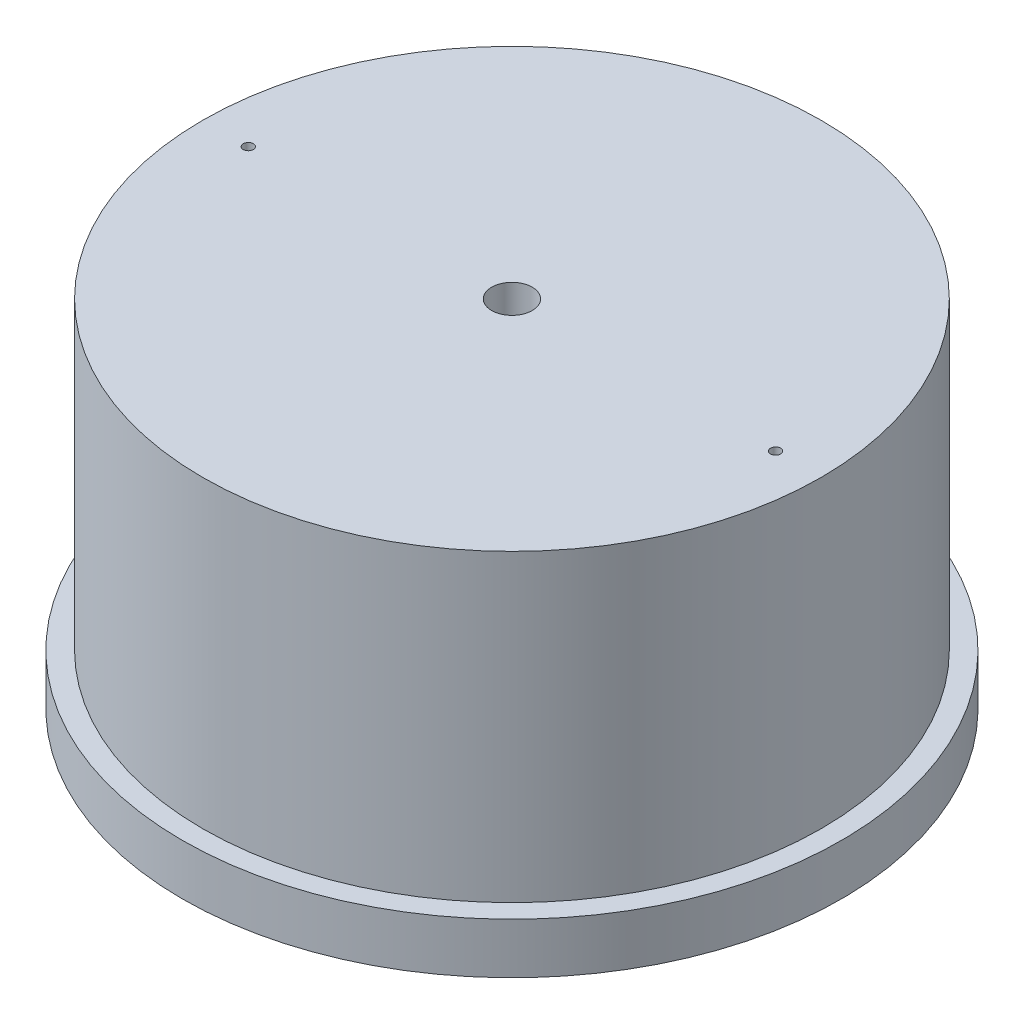
ISO-10303-21;
HEADER;
FILE_DESCRIPTION(('STEP AP214'),'2;1');
FILE_NAME('part.step','',(''),(''),'','','');
FILE_SCHEMA(('AUTOMOTIVE_DESIGN { 1 0 10303 214 1 1 1 1 }'));
ENDSEC;
DATA;
#1=APPLICATION_CONTEXT('core data for automotive mechanical design processes');
#2=APPLICATION_PROTOCOL_DEFINITION('international standard','automotive_design',2000,#1);
#3=PRODUCT_CONTEXT('',#1,'mechanical');
#4=PRODUCT('Part','Part','',(#3));
#5=PRODUCT_RELATED_PRODUCT_CATEGORY('part','',(#4));
#6=PRODUCT_DEFINITION_FORMATION('','',#4);
#7=PRODUCT_DEFINITION_CONTEXT('part definition',#1,'design');
#8=PRODUCT_DEFINITION('design','',#6,#7);
#9=PRODUCT_DEFINITION_SHAPE('','',#8);
#10=(LENGTH_UNIT() NAMED_UNIT(*) SI_UNIT(.MILLI.,.METRE.));
#11=(NAMED_UNIT(*) PLANE_ANGLE_UNIT() SI_UNIT($,.RADIAN.));
#12=(NAMED_UNIT(*) SI_UNIT($,.STERADIAN.) SOLID_ANGLE_UNIT());
#13=UNCERTAINTY_MEASURE_WITH_UNIT(LENGTH_MEASURE(1.E-05),#10,'distance_accuracy_value','');
#14=(GEOMETRIC_REPRESENTATION_CONTEXT(3) GLOBAL_UNCERTAINTY_ASSIGNED_CONTEXT((#13)) GLOBAL_UNIT_ASSIGNED_CONTEXT((#10,
#11,#12)) REPRESENTATION_CONTEXT('',''));
#15=CARTESIAN_POINT('',(0.,0.,0.));
#16=DIRECTION('',(0.,0.,1.));
#17=DIRECTION('',(1.,0.,0.));
#18=AXIS2_PLACEMENT_3D('',#15,#16,#17);
#19=CARTESIAN_POINT('',(0.,35.,0.));
#20=DIRECTION('',(0.,-1.,0.));
#21=DIRECTION('',(0.,0.,-1.));
#22=AXIS2_PLACEMENT_3D('',#19,#20,#21);
#23=CYLINDRICAL_SURFACE('',#22,32.5);
#24=CARTESIAN_POINT('',(0.,0.,0.));
#25=DIRECTION('',(0.,1.,0.));
#26=DIRECTION('',(0.,0.,1.));
#27=AXIS2_PLACEMENT_3D('',#24,#25,#26);
#28=CIRCLE('',#27,32.5);
#29=CARTESIAN_POINT('',(0.,0.,32.5));
#30=VERTEX_POINT('',#29);
#31=EDGE_CURVE('E10',#30,#30,#28,.T.);
#32=ORIENTED_EDGE('',*,*,#31,.T.);
#33=EDGE_LOOP('',(#32));
#34=FACE_BOUND('',#33,.T.);
#35=CARTESIAN_POINT('',(0.,5.,0.));
#36=DIRECTION('',(0.,1.,0.));
#37=DIRECTION('',(0.,0.,1.));
#38=AXIS2_PLACEMENT_3D('',#35,#36,#37);
#39=CIRCLE('',#38,32.5);
#40=CARTESIAN_POINT('',(0.,5.,32.5));
#41=VERTEX_POINT('',#40);
#42=EDGE_CURVE('E37',#41,#41,#39,.T.);
#43=ORIENTED_EDGE('',*,*,#42,.F.);
#44=EDGE_LOOP('',(#43));
#45=FACE_BOUND('',#44,.T.);
#46=ADVANCED_FACE('F30',(#34,#45),#23,.T.);
#47=CARTESIAN_POINT('',(0.,0.,0.));
#48=DIRECTION('',(0.,1.,0.));
#49=DIRECTION('',(0.,0.,1.));
#50=AXIS2_PLACEMENT_3D('',#47,#48,#49);
#51=PLANE('',#50);
#52=CARTESIAN_POINT('',(5.14534135695047E-13,0.,0.));
#53=DIRECTION('',(0.,-1.,0.));
#54=DIRECTION('',(0.,0.,-1.));
#55=AXIS2_PLACEMENT_3D('',#52,#53,#54);
#56=CIRCLE('',#55,27.9999999999888);
#57=CARTESIAN_POINT('',(5.14534135695047E-13,0.,-27.9999999999889));
#58=VERTEX_POINT('',#57);
#59=EDGE_CURVE('E74',#58,#58,#56,.T.);
#60=ORIENTED_EDGE('',*,*,#59,.F.);
#61=EDGE_LOOP('',(#60));
#62=FACE_BOUND('',#61,.T.);
#63=ORIENTED_EDGE('',*,*,#31,.F.);
#64=EDGE_LOOP('',(#63));
#65=FACE_BOUND('',#64,.T.);
#66=ADVANCED_FACE('F101',(#62,#65),#51,.F.);
#67=CARTESIAN_POINT('',(0.,5.,0.));
#68=DIRECTION('',(0.,1.,0.));
#69=DIRECTION('',(0.,0.,1.));
#70=AXIS2_PLACEMENT_3D('',#67,#68,#69);
#71=PLANE('',#70);
#72=CARTESIAN_POINT('',(0.,5.,0.));
#73=DIRECTION('',(0.,1.,0.));
#74=DIRECTION('',(0.,0.,1.));
#75=AXIS2_PLACEMENT_3D('',#72,#73,#74);
#76=CIRCLE('',#75,30.5);
#77=CARTESIAN_POINT('',(0.,5.,30.5));
#78=VERTEX_POINT('',#77);
#79=EDGE_CURVE('E42',#78,#78,#76,.T.);
#80=ORIENTED_EDGE('',*,*,#79,.F.);
#81=EDGE_LOOP('',(#80));
#82=FACE_BOUND('',#81,.T.);
#83=ORIENTED_EDGE('',*,*,#42,.T.);
#84=EDGE_LOOP('',(#83));
#85=FACE_BOUND('',#84,.T.);
#86=ADVANCED_FACE('F91',(#82,#85),#71,.T.);
#87=CARTESIAN_POINT('',(0.,5.,0.));
#88=DIRECTION('',(0.,1.,0.));
#89=DIRECTION('',(0.,0.,1.));
#90=AXIS2_PLACEMENT_3D('',#87,#88,#89);
#91=CYLINDRICAL_SURFACE('',#90,30.5);
#92=ORIENTED_EDGE('',*,*,#79,.T.);
#93=EDGE_LOOP('',(#92));
#94=FACE_BOUND('',#93,.T.);
#95=CARTESIAN_POINT('',(0.,35.,0.));
#96=DIRECTION('',(0.,1.,0.));
#97=DIRECTION('',(0.,0.,1.));
#98=AXIS2_PLACEMENT_3D('',#95,#96,#97);
#99=CIRCLE('',#98,30.5);
#100=CARTESIAN_POINT('',(0.,35.,30.5));
#101=VERTEX_POINT('',#100);
#102=EDGE_CURVE('E80',#101,#101,#99,.T.);
#103=ORIENTED_EDGE('',*,*,#102,.F.);
#104=EDGE_LOOP('',(#103));
#105=FACE_BOUND('',#104,.T.);
#106=ADVANCED_FACE('F89',(#94,#105),#91,.T.);
#107=CARTESIAN_POINT('',(0.,35.,0.));
#108=DIRECTION('',(0.,1.,0.));
#109=DIRECTION('',(0.,0.,1.));
#110=AXIS2_PLACEMENT_3D('',#107,#108,#109);
#111=PLANE('',#110);
#112=CARTESIAN_POINT('',(3.83201503391079E-12,35.,2.27983796420083E-12));
#113=DIRECTION('',(0.,1.,0.));
#114=DIRECTION('',(0.,0.,1.));
#115=AXIS2_PLACEMENT_3D('',#112,#113,#114);
#116=CIRCLE('',#115,2.);
#117=CARTESIAN_POINT('',(3.83201503391079E-12,35.,2.00000000000228));
#118=VERTEX_POINT('',#117);
#119=EDGE_CURVE('E62',#118,#118,#116,.T.);
#120=ORIENTED_EDGE('',*,*,#119,.F.);
#121=EDGE_LOOP('',(#120));
#122=FACE_BOUND('',#121,.T.);
#123=CARTESIAN_POINT('',(26.,35.,0.));
#124=DIRECTION('',(0.,1.,0.));
#125=DIRECTION('',(0.,0.,1.));
#126=AXIS2_PLACEMENT_3D('',#123,#124,#125);
#127=CIRCLE('',#126,0.499999999999999);
#128=CARTESIAN_POINT('',(26.,35.,0.499999999999999));
#129=VERTEX_POINT('',#128);
#130=EDGE_CURVE('E52',#129,#129,#127,.T.);
#131=ORIENTED_EDGE('',*,*,#130,.F.);
#132=EDGE_LOOP('',(#131));
#133=FACE_BOUND('',#132,.T.);
#134=CARTESIAN_POINT('',(-26.,35.,0.));
#135=DIRECTION('',(0.,1.,0.));
#136=DIRECTION('',(0.,0.,1.));
#137=AXIS2_PLACEMENT_3D('',#134,#135,#136);
#138=CIRCLE('',#137,0.499999999999999);
#139=CARTESIAN_POINT('',(-26.,35.,0.499999999999999));
#140=VERTEX_POINT('',#139);
#141=EDGE_CURVE('E49',#140,#140,#138,.T.);
#142=ORIENTED_EDGE('',*,*,#141,.F.);
#143=EDGE_LOOP('',(#142));
#144=FACE_BOUND('',#143,.T.);
#145=ORIENTED_EDGE('',*,*,#102,.T.);
#146=EDGE_LOOP('',(#145));
#147=FACE_BOUND('',#146,.T.);
#148=ADVANCED_FACE('F87',(#122,#133,#144,#147),#111,.T.);
#149=CARTESIAN_POINT('',(5.14534135695047E-13,25.,0.));
#150=DIRECTION('',(0.,-1.,0.));
#151=DIRECTION('',(0.,0.,-1.));
#152=AXIS2_PLACEMENT_3D('',#149,#150,#151);
#153=CYLINDRICAL_SURFACE('',#152,27.9999999999888);
#154=CARTESIAN_POINT('',(5.14534135695047E-13,25.,0.));
#155=DIRECTION('',(0.,-1.,0.));
#156=DIRECTION('',(0.,0.,-1.));
#157=AXIS2_PLACEMENT_3D('',#154,#155,#156);
#158=CIRCLE('',#157,27.9999999999888);
#159=CARTESIAN_POINT('',(5.14534135695047E-13,25.,-27.9999999999889));
#160=VERTEX_POINT('',#159);
#161=EDGE_CURVE('E77',#160,#160,#158,.T.);
#162=ORIENTED_EDGE('',*,*,#161,.F.);
#163=EDGE_LOOP('',(#162));
#164=FACE_BOUND('',#163,.T.);
#165=ORIENTED_EDGE('',*,*,#59,.T.);
#166=EDGE_LOOP('',(#165));
#167=FACE_BOUND('',#166,.T.);
#168=ADVANCED_FACE('F98',(#164,#167),#153,.F.);
#169=CARTESIAN_POINT('',(5.14534135695047E-13,25.,0.));
#170=DIRECTION('',(0.,-1.,0.));
#171=DIRECTION('',(0.,0.,-1.));
#172=AXIS2_PLACEMENT_3D('',#169,#170,#171);
#173=PLANE('',#172);
#174=CARTESIAN_POINT('',(26.,25.,0.));
#175=DIRECTION('',(0.,-1.,0.));
#176=DIRECTION('',(0.,0.,-1.));
#177=AXIS2_PLACEMENT_3D('',#174,#175,#176);
#178=CIRCLE('',#177,0.499999999999999);
#179=CARTESIAN_POINT('',(26.,25.,-0.499999999999999));
#180=VERTEX_POINT('',#179);
#181=EDGE_CURVE('E50',#180,#180,#178,.T.);
#182=ORIENTED_EDGE('',*,*,#181,.F.);
#183=EDGE_LOOP('',(#182));
#184=FACE_BOUND('',#183,.T.);
#185=CARTESIAN_POINT('',(-26.,25.,0.));
#186=DIRECTION('',(0.,-1.,0.));
#187=DIRECTION('',(0.,0.,-1.));
#188=AXIS2_PLACEMENT_3D('',#185,#186,#187);
#189=CIRCLE('',#188,0.499999999999999);
#190=CARTESIAN_POINT('',(-26.,25.,-0.499999999999999));
#191=VERTEX_POINT('',#190);
#192=EDGE_CURVE('E46',#191,#191,#189,.T.);
#193=ORIENTED_EDGE('',*,*,#192,.F.);
#194=EDGE_LOOP('',(#193));
#195=FACE_BOUND('',#194,.T.);
#196=CARTESIAN_POINT('',(5.14534135695047E-13,25.,0.));
#197=DIRECTION('',(0.,-1.,0.));
#198=DIRECTION('',(0.,0.,-1.));
#199=AXIS2_PLACEMENT_3D('',#196,#197,#198);
#200=CIRCLE('',#199,23.9999999999961);
#201=CARTESIAN_POINT('',(5.14534135695047E-13,25.,-23.9999999999962));
#202=VERTEX_POINT('',#201);
#203=EDGE_CURVE('E71',#202,#202,#200,.T.);
#204=ORIENTED_EDGE('',*,*,#203,.F.);
#205=EDGE_LOOP('',(#204));
#206=FACE_BOUND('',#205,.T.);
#207=ORIENTED_EDGE('',*,*,#161,.T.);
#208=EDGE_LOOP('',(#207));
#209=FACE_BOUND('',#208,.T.);
#210=ADVANCED_FACE('F129',(#184,#195,#206,#209),#173,.T.);
#211=CARTESIAN_POINT('',(5.14534135695047E-13,25.,0.));
#212=DIRECTION('',(0.,-1.,0.));
#213=DIRECTION('',(0.,0.,-1.));
#214=AXIS2_PLACEMENT_3D('',#211,#212,#213);
#215=CYLINDRICAL_SURFACE('',#214,23.9999999999961);
#216=ORIENTED_EDGE('',*,*,#203,.T.);
#217=EDGE_LOOP('',(#216));
#218=FACE_BOUND('',#217,.T.);
#219=CARTESIAN_POINT('',(5.14534135695047E-13,0.,0.));
#220=DIRECTION('',(0.,-1.,0.));
#221=DIRECTION('',(0.,0.,-1.));
#222=AXIS2_PLACEMENT_3D('',#219,#220,#221);
#223=CIRCLE('',#222,23.9999999999961);
#224=CARTESIAN_POINT('',(5.14534135695047E-13,0.,-23.9999999999962));
#225=VERTEX_POINT('',#224);
#226=EDGE_CURVE('E68',#225,#225,#223,.T.);
#227=ORIENTED_EDGE('',*,*,#226,.F.);
#228=EDGE_LOOP('',(#227));
#229=FACE_BOUND('',#228,.T.);
#230=ADVANCED_FACE('F120',(#218,#229),#215,.T.);
#231=CARTESIAN_POINT('',(5.14534135695047E-13,0.,0.));
#232=DIRECTION('',(0.,-1.,0.));
#233=DIRECTION('',(0.,0.,-1.));
#234=AXIS2_PLACEMENT_3D('',#231,#232,#233);
#235=CIRCLE('',#234,18.);
#236=CARTESIAN_POINT('',(5.14534135695047E-13,0.,-18.0000000000001));
#237=VERTEX_POINT('',#236);
#238=EDGE_CURVE('E48',#237,#237,#235,.T.);
#239=ORIENTED_EDGE('',*,*,#238,.F.);
#240=EDGE_LOOP('',(#239));
#241=FACE_BOUND('',#240,.T.);
#242=ORIENTED_EDGE('',*,*,#226,.T.);
#243=EDGE_LOOP('',(#242));
#244=FACE_BOUND('',#243,.T.);
#245=ADVANCED_FACE('F110',(#241,#244),#51,.F.);
#246=CARTESIAN_POINT('',(5.14534135695047E-13,20.,0.));
#247=DIRECTION('',(0.,-1.,0.));
#248=DIRECTION('',(0.,0.,-1.));
#249=AXIS2_PLACEMENT_3D('',#246,#247,#248);
#250=CYLINDRICAL_SURFACE('',#249,18.);
#251=CARTESIAN_POINT('',(5.14534135695047E-13,20.,0.));
#252=DIRECTION('',(0.,-1.,0.));
#253=DIRECTION('',(0.,0.,-1.));
#254=AXIS2_PLACEMENT_3D('',#251,#252,#253);
#255=CIRCLE('',#254,18.);
#256=CARTESIAN_POINT('',(5.14534135695047E-13,20.,-18.0000000000001));
#257=VERTEX_POINT('',#256);
#258=EDGE_CURVE('E65',#257,#257,#255,.T.);
#259=ORIENTED_EDGE('',*,*,#258,.F.);
#260=EDGE_LOOP('',(#259));
#261=FACE_BOUND('',#260,.T.);
#262=ORIENTED_EDGE('',*,*,#238,.T.);
#263=EDGE_LOOP('',(#262));
#264=FACE_BOUND('',#263,.T.);
#265=ADVANCED_FACE('F119',(#261,#264),#250,.F.);
#266=CARTESIAN_POINT('',(5.14534135695047E-13,20.,0.));
#267=DIRECTION('',(0.,-1.,0.));
#268=DIRECTION('',(0.,0.,-1.));
#269=AXIS2_PLACEMENT_3D('',#266,#267,#268);
#270=PLANE('',#269);
#271=CARTESIAN_POINT('',(3.83201503391079E-12,20.,2.27983796420083E-12));
#272=DIRECTION('',(0.,-1.,0.));
#273=DIRECTION('',(0.,0.,-1.));
#274=AXIS2_PLACEMENT_3D('',#271,#272,#273);
#275=CIRCLE('',#274,2.);
#276=CARTESIAN_POINT('',(3.83201503391079E-12,20.,-1.99999999999772));
#277=VERTEX_POINT('',#276);
#278=EDGE_CURVE('E33',#277,#277,#275,.T.);
#279=ORIENTED_EDGE('',*,*,#278,.F.);
#280=EDGE_LOOP('',(#279));
#281=FACE_BOUND('',#280,.T.);
#282=ORIENTED_EDGE('',*,*,#258,.T.);
#283=EDGE_LOOP('',(#282));
#284=FACE_BOUND('',#283,.T.);
#285=ADVANCED_FACE('F126',(#281,#284),#270,.T.);
#286=CARTESIAN_POINT('',(-26.,0.,0.));
#287=DIRECTION('',(0.,1.,0.));
#288=DIRECTION('',(0.,0.,1.));
#289=AXIS2_PLACEMENT_3D('',#286,#287,#288);
#290=CYLINDRICAL_SURFACE('',#289,0.499999999999999);
#291=ORIENTED_EDGE('',*,*,#192,.T.);
#292=EDGE_LOOP('',(#291));
#293=FACE_BOUND('',#292,.T.);
#294=ORIENTED_EDGE('',*,*,#141,.T.);
#295=EDGE_LOOP('',(#294));
#296=FACE_BOUND('',#295,.T.);
#297=ADVANCED_FACE('F165',(#293,#296),#290,.F.);
#298=CARTESIAN_POINT('',(26.,0.,0.));
#299=DIRECTION('',(0.,1.,0.));
#300=DIRECTION('',(0.,0.,1.));
#301=AXIS2_PLACEMENT_3D('',#298,#299,#300);
#302=CYLINDRICAL_SURFACE('',#301,0.499999999999999);
#303=ORIENTED_EDGE('',*,*,#181,.T.);
#304=EDGE_LOOP('',(#303));
#305=FACE_BOUND('',#304,.T.);
#306=ORIENTED_EDGE('',*,*,#130,.T.);
#307=EDGE_LOOP('',(#306));
#308=FACE_BOUND('',#307,.T.);
#309=ADVANCED_FACE('F170',(#305,#308),#302,.F.);
#310=CARTESIAN_POINT('',(3.83201503391079E-12,0.,2.27983796420083E-12));
#311=DIRECTION('',(0.,1.,0.));
#312=DIRECTION('',(0.,0.,1.));
#313=AXIS2_PLACEMENT_3D('',#310,#311,#312);
#314=CYLINDRICAL_SURFACE('',#313,2.);
#315=ORIENTED_EDGE('',*,*,#278,.T.);
#316=EDGE_LOOP('',(#315));
#317=FACE_BOUND('',#316,.T.);
#318=ORIENTED_EDGE('',*,*,#119,.T.);
#319=EDGE_LOOP('',(#318));
#320=FACE_BOUND('',#319,.T.);
#321=ADVANCED_FACE('F181',(#317,#320),#314,.F.);
#322=CLOSED_SHELL('',(#46,#66,#86,#106,#148,#168,#210,#230,#245,#265,#285,#297,#309,#321));
#323=MANIFOLD_SOLID_BREP('B2',#322);
#324=ADVANCED_BREP_SHAPE_REPRESENTATION('',(#18,#323),#14);
#325=SHAPE_DEFINITION_REPRESENTATION(#9,#324);
ENDSEC;
END-ISO-10303-21;
